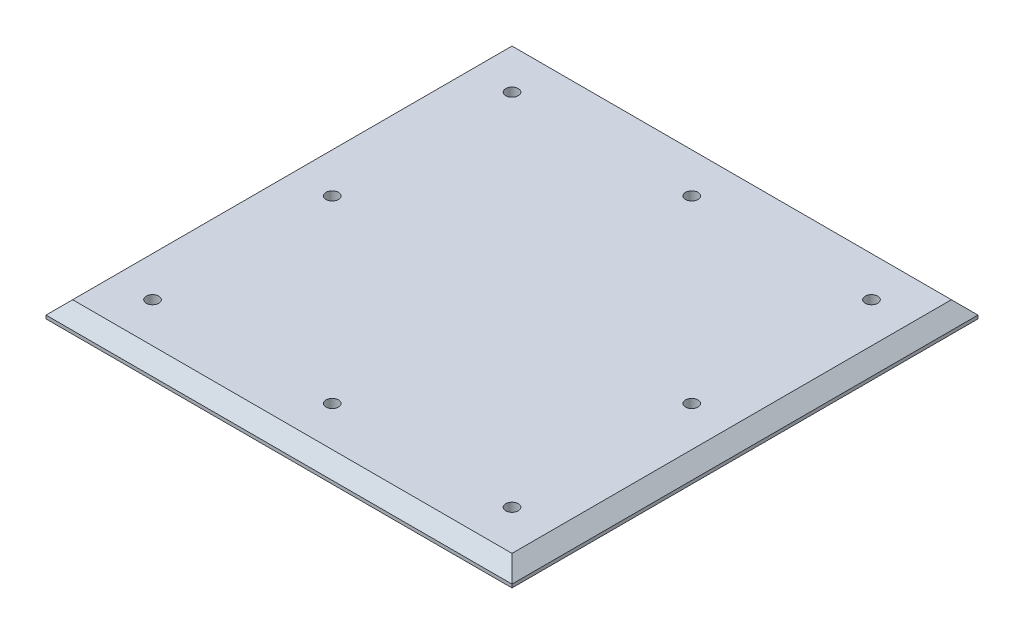
ISO-10303-21;
HEADER;
FILE_DESCRIPTION(('STEP AP214'),'2;1');
FILE_NAME('part.step','',(''),(''),'','','');
FILE_SCHEMA(('AUTOMOTIVE_DESIGN { 1 0 10303 214 1 1 1 1 }'));
ENDSEC;
DATA;
#1=APPLICATION_CONTEXT('core data for automotive mechanical design processes');
#2=APPLICATION_PROTOCOL_DEFINITION('international standard','automotive_design',2000,#1);
#3=PRODUCT_CONTEXT('',#1,'mechanical');
#4=PRODUCT('Part','Part','',(#3));
#5=PRODUCT_RELATED_PRODUCT_CATEGORY('part','',(#4));
#6=PRODUCT_DEFINITION_FORMATION('','',#4);
#7=PRODUCT_DEFINITION_CONTEXT('part definition',#1,'design');
#8=PRODUCT_DEFINITION('design','',#6,#7);
#9=PRODUCT_DEFINITION_SHAPE('','',#8);
#10=(LENGTH_UNIT() NAMED_UNIT(*) SI_UNIT(.MILLI.,.METRE.));
#11=(NAMED_UNIT(*) PLANE_ANGLE_UNIT() SI_UNIT($,.RADIAN.));
#12=(NAMED_UNIT(*) SI_UNIT($,.STERADIAN.) SOLID_ANGLE_UNIT());
#13=UNCERTAINTY_MEASURE_WITH_UNIT(LENGTH_MEASURE(1.E-05),#10,'distance_accuracy_value','');
#14=(GEOMETRIC_REPRESENTATION_CONTEXT(3) GLOBAL_UNCERTAINTY_ASSIGNED_CONTEXT((#13)) GLOBAL_UNIT_ASSIGNED_CONTEXT((#10,
#11,#12)) REPRESENTATION_CONTEXT('',''));
#15=CARTESIAN_POINT('',(0.,0.,0.));
#16=DIRECTION('',(0.,0.,1.));
#17=DIRECTION('',(1.,0.,0.));
#18=AXIS2_PLACEMENT_3D('',#15,#16,#17);
#19=CARTESIAN_POINT('',(0.,6.35,0.));
#20=DIRECTION('',(0.,-1.,0.));
#21=DIRECTION('',(0.,0.,-1.));
#22=AXIS2_PLACEMENT_3D('',#19,#20,#21);
#23=PLANE('',#22);
#24=DIRECTION('',(0.,0.,-1.));
#25=VECTOR('',#24,1.);
#26=CARTESIAN_POINT('',(172.72,6.35,0.));
#27=LINE('',#26,#25);
#28=CARTESIAN_POINT('',(172.72,6.35,-5.08));
#29=VERTEX_POINT('',#28);
#30=CARTESIAN_POINT('',(172.72,6.35,-172.72));
#31=VERTEX_POINT('',#30);
#32=EDGE_CURVE('E123',#29,#31,#27,.T.);
#33=ORIENTED_EDGE('',*,*,#32,.T.);
#34=DIRECTION('',(-1.,0.,0.));
#35=VECTOR('',#34,1.);
#36=CARTESIAN_POINT('',(0.,6.35,-172.72));
#37=LINE('',#36,#35);
#38=CARTESIAN_POINT('',(5.08,6.35,-172.72));
#39=VERTEX_POINT('',#38);
#40=EDGE_CURVE('E127',#31,#39,#37,.T.);
#41=ORIENTED_EDGE('',*,*,#40,.T.);
#42=DIRECTION('',(0.,0.,1.));
#43=VECTOR('',#42,1.);
#44=CARTESIAN_POINT('',(5.08,6.35,0.));
#45=LINE('',#44,#43);
#46=CARTESIAN_POINT('',(5.08,6.35,-5.08));
#47=VERTEX_POINT('',#46);
#48=EDGE_CURVE('E125',#39,#47,#45,.T.);
#49=ORIENTED_EDGE('',*,*,#48,.T.);
#50=DIRECTION('',(1.,0.,0.));
#51=VECTOR('',#50,1.);
#52=CARTESIAN_POINT('',(0.,6.35,-5.08));
#53=LINE('',#52,#51);
#54=EDGE_CURVE('E92',#47,#29,#53,.T.);
#55=ORIENTED_EDGE('',*,*,#54,.T.);
#56=EDGE_LOOP('',(#33,#41,#49,#55));
#57=FACE_BOUND('',#56,.T.);
#58=CARTESIAN_POINT('',(20.32,6.35,-157.48));
#59=DIRECTION('',(0.,1.,0.));
#60=DIRECTION('',(0.,0.,1.));
#61=AXIS2_PLACEMENT_3D('',#58,#59,#60);
#62=CIRCLE('',#61,2.38125);
#63=CARTESIAN_POINT('',(20.32,6.35,-155.09875));
#64=VERTEX_POINT('',#63);
#65=EDGE_CURVE('E108',#64,#64,#62,.T.);
#66=ORIENTED_EDGE('',*,*,#65,.F.);
#67=EDGE_LOOP('',(#66));
#68=FACE_BOUND('',#67,.T.);
#69=CARTESIAN_POINT('',(88.9,6.35,-157.48));
#70=DIRECTION('',(0.,1.,0.));
#71=DIRECTION('',(0.,0.,1.));
#72=AXIS2_PLACEMENT_3D('',#69,#70,#71);
#73=CIRCLE('',#72,2.38125);
#74=CARTESIAN_POINT('',(88.9,6.35,-155.09875));
#75=VERTEX_POINT('',#74);
#76=EDGE_CURVE('E188',#75,#75,#73,.T.);
#77=ORIENTED_EDGE('',*,*,#76,.F.);
#78=EDGE_LOOP('',(#77));
#79=FACE_BOUND('',#78,.T.);
#80=CARTESIAN_POINT('',(157.48,6.35,-157.48));
#81=DIRECTION('',(0.,1.,0.));
#82=DIRECTION('',(0.,0.,1.));
#83=AXIS2_PLACEMENT_3D('',#80,#81,#82);
#84=CIRCLE('',#83,2.38125);
#85=CARTESIAN_POINT('',(157.48,6.35,-155.09875));
#86=VERTEX_POINT('',#85);
#87=EDGE_CURVE('E182',#86,#86,#84,.T.);
#88=ORIENTED_EDGE('',*,*,#87,.F.);
#89=EDGE_LOOP('',(#88));
#90=FACE_BOUND('',#89,.T.);
#91=CARTESIAN_POINT('',(20.32,6.35,-88.9));
#92=DIRECTION('',(0.,1.,0.));
#93=DIRECTION('',(0.,0.,1.));
#94=AXIS2_PLACEMENT_3D('',#91,#92,#93);
#95=CIRCLE('',#94,2.38125);
#96=CARTESIAN_POINT('',(20.32,6.35,-86.51875));
#97=VERTEX_POINT('',#96);
#98=EDGE_CURVE('E176',#97,#97,#95,.T.);
#99=ORIENTED_EDGE('',*,*,#98,.F.);
#100=EDGE_LOOP('',(#99));
#101=FACE_BOUND('',#100,.T.);
#102=CARTESIAN_POINT('',(20.32,6.35,-20.32));
#103=DIRECTION('',(0.,1.,0.));
#104=DIRECTION('',(0.,0.,1.));
#105=AXIS2_PLACEMENT_3D('',#102,#103,#104);
#106=CIRCLE('',#105,2.38125);
#107=CARTESIAN_POINT('',(20.32,6.35,-17.93875));
#108=VERTEX_POINT('',#107);
#109=EDGE_CURVE('E170',#108,#108,#106,.T.);
#110=ORIENTED_EDGE('',*,*,#109,.F.);
#111=EDGE_LOOP('',(#110));
#112=FACE_BOUND('',#111,.T.);
#113=CARTESIAN_POINT('',(88.9,6.35,-20.32));
#114=DIRECTION('',(0.,1.,0.));
#115=DIRECTION('',(0.,0.,1.));
#116=AXIS2_PLACEMENT_3D('',#113,#114,#115);
#117=CIRCLE('',#116,2.38125000000001);
#118=CARTESIAN_POINT('',(88.9,6.35,-17.93875));
#119=VERTEX_POINT('',#118);
#120=EDGE_CURVE('E164',#119,#119,#117,.T.);
#121=ORIENTED_EDGE('',*,*,#120,.F.);
#122=EDGE_LOOP('',(#121));
#123=FACE_BOUND('',#122,.T.);
#124=CARTESIAN_POINT('',(157.48,6.35,-88.9));
#125=DIRECTION('',(0.,1.,0.));
#126=DIRECTION('',(0.,0.,1.));
#127=AXIS2_PLACEMENT_3D('',#124,#125,#126);
#128=CIRCLE('',#127,2.38125);
#129=CARTESIAN_POINT('',(157.48,6.35,-86.51875));
#130=VERTEX_POINT('',#129);
#131=EDGE_CURVE('E158',#130,#130,#128,.T.);
#132=ORIENTED_EDGE('',*,*,#131,.F.);
#133=EDGE_LOOP('',(#132));
#134=FACE_BOUND('',#133,.T.);
#135=CARTESIAN_POINT('',(157.48,6.35,-20.32));
#136=DIRECTION('',(0.,1.,0.));
#137=DIRECTION('',(0.,0.,1.));
#138=AXIS2_PLACEMENT_3D('',#135,#136,#137);
#139=CIRCLE('',#138,2.38125000000001);
#140=CARTESIAN_POINT('',(157.48,6.35,-17.93875));
#141=VERTEX_POINT('',#140);
#142=EDGE_CURVE('E150',#141,#141,#139,.T.);
#143=ORIENTED_EDGE('',*,*,#142,.F.);
#144=EDGE_LOOP('',(#143));
#145=FACE_BOUND('',#144,.T.);
#146=ADVANCED_FACE('F33',(#57,#68,#79,#90,#101,#112,#123,#134,#145),#23,.F.);
#147=CARTESIAN_POINT('',(0.,0.,0.));
#148=DIRECTION('',(0.,-1.,0.));
#149=DIRECTION('',(0.,0.,-1.));
#150=AXIS2_PLACEMENT_3D('',#147,#148,#149);
#151=PLANE('',#150);
#152=CARTESIAN_POINT('',(157.48,0.,-88.9));
#153=DIRECTION('',(0.,1.,0.));
#154=DIRECTION('',(0.,0.,1.));
#155=AXIS2_PLACEMENT_3D('',#152,#153,#154);
#156=CIRCLE('',#155,2.38125);
#157=CARTESIAN_POINT('',(157.48,0.,-86.51875));
#158=VERTEX_POINT('',#157);
#159=EDGE_CURVE('E155',#158,#158,#156,.T.);
#160=ORIENTED_EDGE('',*,*,#159,.T.);
#161=EDGE_LOOP('',(#160));
#162=FACE_BOUND('',#161,.T.);
#163=CARTESIAN_POINT('',(20.32,0.,-20.32));
#164=DIRECTION('',(0.,1.,0.));
#165=DIRECTION('',(0.,0.,1.));
#166=AXIS2_PLACEMENT_3D('',#163,#164,#165);
#167=CIRCLE('',#166,2.38125);
#168=CARTESIAN_POINT('',(20.32,0.,-17.93875));
#169=VERTEX_POINT('',#168);
#170=EDGE_CURVE('E167',#169,#169,#167,.T.);
#171=ORIENTED_EDGE('',*,*,#170,.T.);
#172=EDGE_LOOP('',(#171));
#173=FACE_BOUND('',#172,.T.);
#174=CARTESIAN_POINT('',(157.48,0.,-157.48));
#175=DIRECTION('',(0.,1.,0.));
#176=DIRECTION('',(0.,0.,1.));
#177=AXIS2_PLACEMENT_3D('',#174,#175,#176);
#178=CIRCLE('',#177,2.38125);
#179=CARTESIAN_POINT('',(157.48,0.,-155.09875));
#180=VERTEX_POINT('',#179);
#181=EDGE_CURVE('E179',#180,#180,#178,.T.);
#182=ORIENTED_EDGE('',*,*,#181,.T.);
#183=EDGE_LOOP('',(#182));
#184=FACE_BOUND('',#183,.T.);
#185=CARTESIAN_POINT('',(20.32,0.,-157.48));
#186=DIRECTION('',(0.,1.,0.));
#187=DIRECTION('',(0.,0.,1.));
#188=AXIS2_PLACEMENT_3D('',#185,#186,#187);
#189=CIRCLE('',#188,2.38125);
#190=CARTESIAN_POINT('',(20.32,0.,-155.09875));
#191=VERTEX_POINT('',#190);
#192=EDGE_CURVE('E111',#191,#191,#189,.T.);
#193=ORIENTED_EDGE('',*,*,#192,.T.);
#194=EDGE_LOOP('',(#193));
#195=FACE_BOUND('',#194,.T.);
#196=DIRECTION('',(0.,0.,1.));
#197=VECTOR('',#196,1.);
#198=CARTESIAN_POINT('',(0.,0.,0.));
#199=LINE('',#198,#197);
#200=CARTESIAN_POINT('',(0.,0.,-177.8));
#201=VERTEX_POINT('',#200);
#202=CARTESIAN_POINT('',(0.,0.,0.));
#203=VERTEX_POINT('',#202);
#204=EDGE_CURVE('E100',#201,#203,#199,.T.);
#205=ORIENTED_EDGE('',*,*,#204,.F.);
#206=DIRECTION('',(-1.,0.,0.));
#207=VECTOR('',#206,1.);
#208=CARTESIAN_POINT('',(0.,0.,-177.8));
#209=LINE('',#208,#207);
#210=CARTESIAN_POINT('',(177.8,0.,-177.8));
#211=VERTEX_POINT('',#210);
#212=EDGE_CURVE('E116',#211,#201,#209,.T.);
#213=ORIENTED_EDGE('',*,*,#212,.F.);
#214=DIRECTION('',(0.,0.,-1.));
#215=VECTOR('',#214,1.);
#216=CARTESIAN_POINT('',(177.8,0.,0.));
#217=LINE('',#216,#215);
#218=CARTESIAN_POINT('',(177.8,0.,0.));
#219=VERTEX_POINT('',#218);
#220=EDGE_CURVE('E102',#219,#211,#217,.T.);
#221=ORIENTED_EDGE('',*,*,#220,.F.);
#222=DIRECTION('',(1.,0.,0.));
#223=VECTOR('',#222,1.);
#224=CARTESIAN_POINT('',(0.,0.,0.));
#225=LINE('',#224,#223);
#226=EDGE_CURVE('E87',#203,#219,#225,.T.);
#227=ORIENTED_EDGE('',*,*,#226,.F.);
#228=EDGE_LOOP('',(#205,#213,#221,#227));
#229=FACE_BOUND('',#228,.T.);
#230=CARTESIAN_POINT('',(88.9,0.,-157.48));
#231=DIRECTION('',(0.,1.,0.));
#232=DIRECTION('',(0.,0.,1.));
#233=AXIS2_PLACEMENT_3D('',#230,#231,#232);
#234=CIRCLE('',#233,2.38125);
#235=CARTESIAN_POINT('',(88.9,0.,-155.09875));
#236=VERTEX_POINT('',#235);
#237=EDGE_CURVE('E185',#236,#236,#234,.T.);
#238=ORIENTED_EDGE('',*,*,#237,.T.);
#239=EDGE_LOOP('',(#238));
#240=FACE_BOUND('',#239,.T.);
#241=CARTESIAN_POINT('',(20.32,0.,-88.9));
#242=DIRECTION('',(0.,1.,0.));
#243=DIRECTION('',(0.,0.,1.));
#244=AXIS2_PLACEMENT_3D('',#241,#242,#243);
#245=CIRCLE('',#244,2.38125);
#246=CARTESIAN_POINT('',(20.32,0.,-86.51875));
#247=VERTEX_POINT('',#246);
#248=EDGE_CURVE('E173',#247,#247,#245,.T.);
#249=ORIENTED_EDGE('',*,*,#248,.T.);
#250=EDGE_LOOP('',(#249));
#251=FACE_BOUND('',#250,.T.);
#252=CARTESIAN_POINT('',(88.9,0.,-20.32));
#253=DIRECTION('',(0.,1.,0.));
#254=DIRECTION('',(0.,0.,1.));
#255=AXIS2_PLACEMENT_3D('',#252,#253,#254);
#256=CIRCLE('',#255,2.38125000000001);
#257=CARTESIAN_POINT('',(88.9,0.,-17.93875));
#258=VERTEX_POINT('',#257);
#259=EDGE_CURVE('E161',#258,#258,#256,.T.);
#260=ORIENTED_EDGE('',*,*,#259,.T.);
#261=EDGE_LOOP('',(#260));
#262=FACE_BOUND('',#261,.T.);
#263=CARTESIAN_POINT('',(157.48,0.,-20.32));
#264=DIRECTION('',(0.,1.,0.));
#265=DIRECTION('',(0.,0.,1.));
#266=AXIS2_PLACEMENT_3D('',#263,#264,#265);
#267=CIRCLE('',#266,2.38125000000001);
#268=CARTESIAN_POINT('',(157.48,0.,-17.93875));
#269=VERTEX_POINT('',#268);
#270=EDGE_CURVE('E145',#269,#269,#267,.T.);
#271=ORIENTED_EDGE('',*,*,#270,.T.);
#272=EDGE_LOOP('',(#271));
#273=FACE_BOUND('',#272,.T.);
#274=ADVANCED_FACE('F97',(#162,#173,#184,#195,#229,#240,#251,#262,#273),#151,.T.);
#275=CARTESIAN_POINT('',(0.,6.35,0.));
#276=DIRECTION('',(1.,0.,0.));
#277=DIRECTION('',(0.,0.,-1.));
#278=AXIS2_PLACEMENT_3D('',#275,#276,#277);
#279=PLANE('',#278);
#280=DIRECTION('',(0.,-1.,0.));
#281=VECTOR('',#280,1.);
#282=CARTESIAN_POINT('',(0.,6.35,0.));
#283=LINE('',#282,#281);
#284=CARTESIAN_POINT('',(0.,1.27,0.));
#285=VERTEX_POINT('',#284);
#286=EDGE_CURVE('E84',#285,#203,#283,.T.);
#287=ORIENTED_EDGE('',*,*,#286,.F.);
#288=DIRECTION('',(0.,0.,-1.));
#289=VECTOR('',#288,1.);
#290=CARTESIAN_POINT('',(0.,1.27,0.));
#291=LINE('',#290,#289);
#292=CARTESIAN_POINT('',(0.,1.27,-177.8));
#293=VERTEX_POINT('',#292);
#294=EDGE_CURVE('E133',#285,#293,#291,.T.);
#295=ORIENTED_EDGE('',*,*,#294,.T.);
#296=DIRECTION('',(0.,-1.,0.));
#297=VECTOR('',#296,1.);
#298=CARTESIAN_POINT('',(0.,6.35,-177.8));
#299=LINE('',#298,#297);
#300=EDGE_CURVE('E106',#293,#201,#299,.T.);
#301=ORIENTED_EDGE('',*,*,#300,.T.);
#302=ORIENTED_EDGE('',*,*,#204,.T.);
#303=EDGE_LOOP('',(#287,#295,#301,#302));
#304=FACE_BOUND('',#303,.T.);
#305=ADVANCED_FACE('F104',(#304),#279,.F.);
#306=CARTESIAN_POINT('',(0.,6.35,0.));
#307=DIRECTION('',(0.,0.,-1.));
#308=DIRECTION('',(-1.,0.,0.));
#309=AXIS2_PLACEMENT_3D('',#306,#307,#308);
#310=PLANE('',#309);
#311=DIRECTION('',(0.,-1.,0.));
#312=VECTOR('',#311,1.);
#313=CARTESIAN_POINT('',(177.8,6.35,0.));
#314=LINE('',#313,#312);
#315=CARTESIAN_POINT('',(177.8,1.27,0.));
#316=VERTEX_POINT('',#315);
#317=EDGE_CURVE('E93',#316,#219,#314,.T.);
#318=ORIENTED_EDGE('',*,*,#317,.F.);
#319=DIRECTION('',(-1.,0.,0.));
#320=VECTOR('',#319,1.);
#321=CARTESIAN_POINT('',(0.,1.27,0.));
#322=LINE('',#321,#320);
#323=EDGE_CURVE('E11',#316,#285,#322,.T.);
#324=ORIENTED_EDGE('',*,*,#323,.T.);
#325=ORIENTED_EDGE('',*,*,#286,.T.);
#326=ORIENTED_EDGE('',*,*,#226,.T.);
#327=EDGE_LOOP('',(#318,#324,#325,#326));
#328=FACE_BOUND('',#327,.T.);
#329=ADVANCED_FACE('F86',(#328),#310,.F.);
#330=CARTESIAN_POINT('',(177.8,6.35,0.));
#331=DIRECTION('',(-1.,0.,0.));
#332=DIRECTION('',(0.,0.,1.));
#333=AXIS2_PLACEMENT_3D('',#330,#331,#332);
#334=PLANE('',#333);
#335=DIRECTION('',(0.,-1.,0.));
#336=VECTOR('',#335,1.);
#337=CARTESIAN_POINT('',(177.8,6.35,-177.8));
#338=LINE('',#337,#336);
#339=CARTESIAN_POINT('',(177.8,1.27,-177.8));
#340=VERTEX_POINT('',#339);
#341=EDGE_CURVE('E119',#340,#211,#338,.T.);
#342=ORIENTED_EDGE('',*,*,#341,.F.);
#343=DIRECTION('',(0.,0.,1.));
#344=VECTOR('',#343,1.);
#345=CARTESIAN_POINT('',(177.8,1.27,0.));
#346=LINE('',#345,#344);
#347=EDGE_CURVE('E42',#340,#316,#346,.T.);
#348=ORIENTED_EDGE('',*,*,#347,.T.);
#349=ORIENTED_EDGE('',*,*,#317,.T.);
#350=ORIENTED_EDGE('',*,*,#220,.T.);
#351=EDGE_LOOP('',(#342,#348,#349,#350));
#352=FACE_BOUND('',#351,.T.);
#353=ADVANCED_FACE('F223',(#352),#334,.F.);
#354=CARTESIAN_POINT('',(0.,6.35,-177.8));
#355=DIRECTION('',(0.,0.,1.));
#356=DIRECTION('',(1.,0.,0.));
#357=AXIS2_PLACEMENT_3D('',#354,#355,#356);
#358=PLANE('',#357);
#359=ORIENTED_EDGE('',*,*,#300,.F.);
#360=DIRECTION('',(1.,0.,0.));
#361=VECTOR('',#360,1.);
#362=CARTESIAN_POINT('',(0.,1.27,-177.8));
#363=LINE('',#362,#361);
#364=EDGE_CURVE('E130',#293,#340,#363,.T.);
#365=ORIENTED_EDGE('',*,*,#364,.T.);
#366=ORIENTED_EDGE('',*,*,#341,.T.);
#367=ORIENTED_EDGE('',*,*,#212,.T.);
#368=EDGE_LOOP('',(#359,#365,#366,#367));
#369=FACE_BOUND('',#368,.T.);
#370=ADVANCED_FACE('F208',(#369),#358,.F.);
#371=CARTESIAN_POINT('',(20.32,6.35,-157.48));
#372=DIRECTION('',(0.,-1.,0.));
#373=DIRECTION('',(0.,0.,-1.));
#374=AXIS2_PLACEMENT_3D('',#371,#372,#373);
#375=CYLINDRICAL_SURFACE('',#374,2.38125);
#376=ORIENTED_EDGE('',*,*,#65,.T.);
#377=EDGE_LOOP('',(#376));
#378=FACE_BOUND('',#377,.T.);
#379=ORIENTED_EDGE('',*,*,#192,.F.);
#380=EDGE_LOOP('',(#379));
#381=FACE_BOUND('',#380,.T.);
#382=ADVANCED_FACE('F198',(#378,#381),#375,.F.);
#383=CARTESIAN_POINT('',(88.9,6.35,-157.48));
#384=DIRECTION('',(0.,-1.,0.));
#385=DIRECTION('',(0.,0.,-1.));
#386=AXIS2_PLACEMENT_3D('',#383,#384,#385);
#387=CYLINDRICAL_SURFACE('',#386,2.38125);
#388=ORIENTED_EDGE('',*,*,#76,.T.);
#389=EDGE_LOOP('',(#388));
#390=FACE_BOUND('',#389,.T.);
#391=ORIENTED_EDGE('',*,*,#237,.F.);
#392=EDGE_LOOP('',(#391));
#393=FACE_BOUND('',#392,.T.);
#394=ADVANCED_FACE('F195',(#390,#393),#387,.F.);
#395=CARTESIAN_POINT('',(157.48,6.35,-157.48));
#396=DIRECTION('',(0.,-1.,0.));
#397=DIRECTION('',(0.,0.,-1.));
#398=AXIS2_PLACEMENT_3D('',#395,#396,#397);
#399=CYLINDRICAL_SURFACE('',#398,2.38125);
#400=ORIENTED_EDGE('',*,*,#87,.T.);
#401=EDGE_LOOP('',(#400));
#402=FACE_BOUND('',#401,.T.);
#403=ORIENTED_EDGE('',*,*,#181,.F.);
#404=EDGE_LOOP('',(#403));
#405=FACE_BOUND('',#404,.T.);
#406=ADVANCED_FACE('F197',(#402,#405),#399,.F.);
#407=CARTESIAN_POINT('',(20.32,6.35,-88.9));
#408=DIRECTION('',(0.,-1.,0.));
#409=DIRECTION('',(0.,0.,-1.));
#410=AXIS2_PLACEMENT_3D('',#407,#408,#409);
#411=CYLINDRICAL_SURFACE('',#410,2.38125);
#412=ORIENTED_EDGE('',*,*,#98,.T.);
#413=EDGE_LOOP('',(#412));
#414=FACE_BOUND('',#413,.T.);
#415=ORIENTED_EDGE('',*,*,#248,.F.);
#416=EDGE_LOOP('',(#415));
#417=FACE_BOUND('',#416,.T.);
#418=ADVANCED_FACE('F205',(#414,#417),#411,.F.);
#419=CARTESIAN_POINT('',(20.32,6.35,-20.32));
#420=DIRECTION('',(0.,-1.,0.));
#421=DIRECTION('',(0.,0.,-1.));
#422=AXIS2_PLACEMENT_3D('',#419,#420,#421);
#423=CYLINDRICAL_SURFACE('',#422,2.38125);
#424=ORIENTED_EDGE('',*,*,#109,.T.);
#425=EDGE_LOOP('',(#424));
#426=FACE_BOUND('',#425,.T.);
#427=ORIENTED_EDGE('',*,*,#170,.F.);
#428=EDGE_LOOP('',(#427));
#429=FACE_BOUND('',#428,.T.);
#430=ADVANCED_FACE('F265',(#426,#429),#423,.F.);
#431=CARTESIAN_POINT('',(88.9,6.35,-20.32));
#432=DIRECTION('',(0.,-1.,0.));
#433=DIRECTION('',(0.,0.,-1.));
#434=AXIS2_PLACEMENT_3D('',#431,#432,#433);
#435=CYLINDRICAL_SURFACE('',#434,2.38125000000001);
#436=ORIENTED_EDGE('',*,*,#120,.T.);
#437=EDGE_LOOP('',(#436));
#438=FACE_BOUND('',#437,.T.);
#439=ORIENTED_EDGE('',*,*,#259,.F.);
#440=EDGE_LOOP('',(#439));
#441=FACE_BOUND('',#440,.T.);
#442=ADVANCED_FACE('F258',(#438,#441),#435,.F.);
#443=CARTESIAN_POINT('',(157.48,6.35,-88.9));
#444=DIRECTION('',(0.,-1.,0.));
#445=DIRECTION('',(0.,0.,-1.));
#446=AXIS2_PLACEMENT_3D('',#443,#444,#445);
#447=CYLINDRICAL_SURFACE('',#446,2.38125);
#448=ORIENTED_EDGE('',*,*,#131,.T.);
#449=EDGE_LOOP('',(#448));
#450=FACE_BOUND('',#449,.T.);
#451=ORIENTED_EDGE('',*,*,#159,.F.);
#452=EDGE_LOOP('',(#451));
#453=FACE_BOUND('',#452,.T.);
#454=ADVANCED_FACE('F247',(#450,#453),#447,.F.);
#455=CARTESIAN_POINT('',(157.48,6.35,-20.32));
#456=DIRECTION('',(0.,-1.,0.));
#457=DIRECTION('',(0.,0.,-1.));
#458=AXIS2_PLACEMENT_3D('',#455,#456,#457);
#459=CYLINDRICAL_SURFACE('',#458,2.38125000000001);
#460=ORIENTED_EDGE('',*,*,#142,.T.);
#461=EDGE_LOOP('',(#460));
#462=FACE_BOUND('',#461,.T.);
#463=ORIENTED_EDGE('',*,*,#270,.F.);
#464=EDGE_LOOP('',(#463));
#465=FACE_BOUND('',#464,.T.);
#466=ADVANCED_FACE('F242',(#462,#465),#459,.F.);
#467=CARTESIAN_POINT('',(0.,6.35,-5.08));
#468=DIRECTION('',(0.,-0.707106781186548,-0.707106781186548));
#469=DIRECTION('',(1.,0.,0.));
#470=AXIS2_PLACEMENT_3D('',#467,#468,#469);
#471=PLANE('',#470);
#472=DIRECTION('',(-0.577350269189626,-0.577350269189626,0.577350269189626));
#473=VECTOR('',#472,1.);
#474=CARTESIAN_POINT('',(3.38666666666667,4.65666666666667,-3.38666666666667));
#475=LINE('',#474,#473);
#476=EDGE_CURVE('E139',#285,#47,#475,.F.);
#477=ORIENTED_EDGE('',*,*,#476,.F.);
#478=ORIENTED_EDGE('',*,*,#323,.F.);
#479=DIRECTION('',(-0.577350269189626,0.577350269189626,-0.577350269189626));
#480=VECTOR('',#479,1.);
#481=CARTESIAN_POINT('',(115.146666666667,63.9233333333333,-62.6533333333333));
#482=LINE('',#481,#480);
#483=EDGE_CURVE('E37',#29,#316,#482,.F.);
#484=ORIENTED_EDGE('',*,*,#483,.F.);
#485=ORIENTED_EDGE('',*,*,#54,.F.);
#486=EDGE_LOOP('',(#477,#478,#484,#485));
#487=FACE_BOUND('',#486,.T.);
#488=ADVANCED_FACE('F35',(#487),#471,.F.);
#489=CARTESIAN_POINT('',(172.72,6.35,0.));
#490=DIRECTION('',(-0.707106781186548,-0.707106781186548,0.));
#491=DIRECTION('',(0.,0.,-1.));
#492=AXIS2_PLACEMENT_3D('',#489,#490,#491);
#493=PLANE('',#492);
#494=ORIENTED_EDGE('',*,*,#483,.T.);
#495=ORIENTED_EDGE('',*,*,#347,.F.);
#496=DIRECTION('',(-0.577350269189626,0.577350269189626,0.577350269189626));
#497=VECTOR('',#496,1.);
#498=CARTESIAN_POINT('',(115.146666666667,63.9233333333333,-115.146666666667));
#499=LINE('',#498,#497);
#500=EDGE_CURVE('E138',#31,#340,#499,.F.);
#501=ORIENTED_EDGE('',*,*,#500,.F.);
#502=ORIENTED_EDGE('',*,*,#32,.F.);
#503=EDGE_LOOP('',(#494,#495,#501,#502));
#504=FACE_BOUND('',#503,.T.);
#505=ADVANCED_FACE('F237',(#504),#493,.F.);
#506=CARTESIAN_POINT('',(5.08,6.35,0.));
#507=DIRECTION('',(0.707106781186548,-0.707106781186548,0.));
#508=DIRECTION('',(0.,0.,1.));
#509=AXIS2_PLACEMENT_3D('',#506,#507,#508);
#510=PLANE('',#509);
#511=ORIENTED_EDGE('',*,*,#476,.T.);
#512=ORIENTED_EDGE('',*,*,#48,.F.);
#513=DIRECTION('',(-0.577350269189626,-0.577350269189626,-0.577350269189626));
#514=VECTOR('',#513,1.);
#515=CARTESIAN_POINT('',(62.6533333333333,63.9233333333333,-115.146666666667));
#516=LINE('',#515,#514);
#517=EDGE_CURVE('E136',#293,#39,#516,.F.);
#518=ORIENTED_EDGE('',*,*,#517,.F.);
#519=ORIENTED_EDGE('',*,*,#294,.F.);
#520=EDGE_LOOP('',(#511,#512,#518,#519));
#521=FACE_BOUND('',#520,.T.);
#522=ADVANCED_FACE('F234',(#521),#510,.F.);
#523=CARTESIAN_POINT('',(0.,6.35,-172.72));
#524=DIRECTION('',(0.,-0.707106781186548,0.707106781186548));
#525=DIRECTION('',(-1.,0.,0.));
#526=AXIS2_PLACEMENT_3D('',#523,#524,#525);
#527=PLANE('',#526);
#528=ORIENTED_EDGE('',*,*,#500,.T.);
#529=ORIENTED_EDGE('',*,*,#364,.F.);
#530=ORIENTED_EDGE('',*,*,#517,.T.);
#531=ORIENTED_EDGE('',*,*,#40,.F.);
#532=EDGE_LOOP('',(#528,#529,#530,#531));
#533=FACE_BOUND('',#532,.T.);
#534=ADVANCED_FACE('F231',(#533),#527,.F.);
#535=CLOSED_SHELL('',(#146,#274,#305,#329,#353,#370,#382,#394,#406,#418,#430,#442,#454,#466,
#488,#505,#522,#534));
#536=MANIFOLD_SOLID_BREP('B2',#535);
#537=ADVANCED_BREP_SHAPE_REPRESENTATION('',(#18,#536),#14);
#538=SHAPE_DEFINITION_REPRESENTATION(#9,#537);
ENDSEC;
END-ISO-10303-21;
